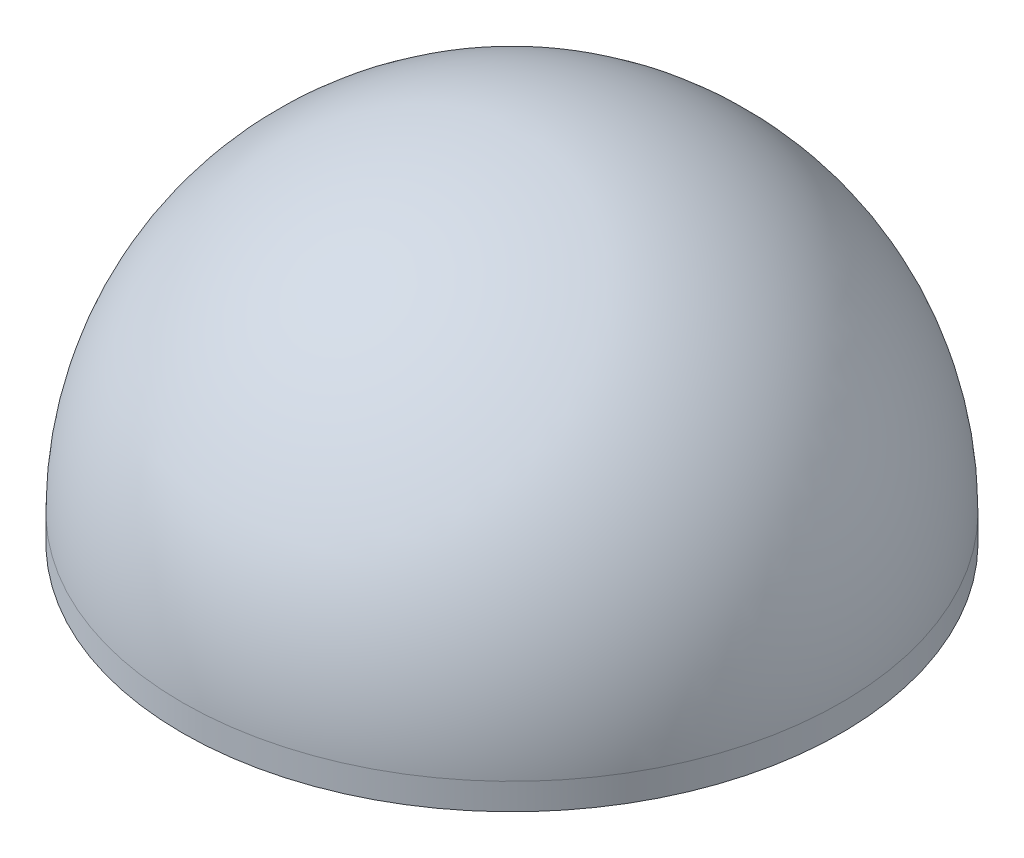
ISO-10303-21;
HEADER;
FILE_DESCRIPTION(('STEP AP214'),'2;1');
FILE_NAME('part.step','',(''),(''),'','','');
FILE_SCHEMA(('AUTOMOTIVE_DESIGN { 1 0 10303 214 1 1 1 1 }'));
ENDSEC;
DATA;
#1=APPLICATION_CONTEXT('core data for automotive mechanical design processes');
#2=APPLICATION_PROTOCOL_DEFINITION('international standard','automotive_design',2000,#1);
#3=PRODUCT_CONTEXT('',#1,'mechanical');
#4=PRODUCT('Part','Part','',(#3));
#5=PRODUCT_RELATED_PRODUCT_CATEGORY('part','',(#4));
#6=PRODUCT_DEFINITION_FORMATION('','',#4);
#7=PRODUCT_DEFINITION_CONTEXT('part definition',#1,'design');
#8=PRODUCT_DEFINITION('design','',#6,#7);
#9=PRODUCT_DEFINITION_SHAPE('','',#8);
#10=(LENGTH_UNIT() NAMED_UNIT(*) SI_UNIT(.MILLI.,.METRE.));
#11=(NAMED_UNIT(*) PLANE_ANGLE_UNIT() SI_UNIT($,.RADIAN.));
#12=(NAMED_UNIT(*) SI_UNIT($,.STERADIAN.) SOLID_ANGLE_UNIT());
#13=UNCERTAINTY_MEASURE_WITH_UNIT(LENGTH_MEASURE(1.E-05),#10,'distance_accuracy_value','');
#14=(GEOMETRIC_REPRESENTATION_CONTEXT(3) GLOBAL_UNCERTAINTY_ASSIGNED_CONTEXT((#13)) GLOBAL_UNIT_ASSIGNED_CONTEXT((#10,
#11,#12)) REPRESENTATION_CONTEXT('',''));
#15=CARTESIAN_POINT('',(0.,0.,0.));
#16=DIRECTION('',(0.,0.,1.));
#17=DIRECTION('',(1.,0.,0.));
#18=AXIS2_PLACEMENT_3D('',#15,#16,#17);
#19=CARTESIAN_POINT('',(0.,2.,0.));
#20=DIRECTION('',(0.,-1.,0.));
#21=DIRECTION('',(0.,0.,-1.));
#22=AXIS2_PLACEMENT_3D('',#19,#20,#21);
#23=CYLINDRICAL_SURFACE('',#22,25.);
#24=CARTESIAN_POINT('',(0.,2.,0.));
#25=DIRECTION('',(0.,1.,0.));
#26=DIRECTION('',(0.,0.,1.));
#27=AXIS2_PLACEMENT_3D('',#24,#25,#26);
#28=CIRCLE('',#27,25.);
#29=CARTESIAN_POINT('',(0.,2.,25.));
#30=VERTEX_POINT('',#29);
#31=EDGE_CURVE('E10',#30,#30,#28,.T.);
#32=ORIENTED_EDGE('',*,*,#31,.F.);
#33=EDGE_LOOP('',(#32));
#34=FACE_BOUND('',#33,.T.);
#35=CARTESIAN_POINT('',(0.,0.,0.));
#36=DIRECTION('',(0.,1.,0.));
#37=DIRECTION('',(0.,0.,1.));
#38=AXIS2_PLACEMENT_3D('',#35,#36,#37);
#39=CIRCLE('',#38,25.);
#40=CARTESIAN_POINT('',(0.,0.,25.));
#41=VERTEX_POINT('',#40);
#42=EDGE_CURVE('E48',#41,#41,#39,.T.);
#43=ORIENTED_EDGE('',*,*,#42,.T.);
#44=EDGE_LOOP('',(#43));
#45=FACE_BOUND('',#44,.T.);
#46=ADVANCED_FACE('F41',(#34,#45),#23,.T.);
#47=CARTESIAN_POINT('',(0.,2.,0.));
#48=DIRECTION('',(0.,0.,1.));
#49=DIRECTION('',(1.,0.,0.));
#50=AXIS2_PLACEMENT_3D('',#47,#48,#49);
#51=SPHERICAL_SURFACE('',#50,25.);
#52=CARTESIAN_POINT('',(0.,2.,0.));
#53=DIRECTION('',(0.,1.,0.));
#54=DIRECTION('',(0.,0.,1.));
#55=AXIS2_PLACEMENT_3D('',#52,#53,#54);
#56=SPHERICAL_SURFACE('',#55,25.);
#57=ORIENTED_EDGE('',*,*,#31,.T.);
#58=EDGE_LOOP('',(#57));
#59=FACE_BOUND('',#58,.T.);
#60=ADVANCED_FACE('F43',(#59),#56,.T.);
#61=CARTESIAN_POINT('',(0.,0.,0.));
#62=DIRECTION('',(0.,1.,0.));
#63=DIRECTION('',(0.,0.,1.));
#64=AXIS2_PLACEMENT_3D('',#61,#62,#63);
#65=PLANE('',#64);
#66=CARTESIAN_POINT('',(0.,0.,0.));
#67=DIRECTION('',(0.,1.,0.));
#68=DIRECTION('',(0.,0.,1.));
#69=AXIS2_PLACEMENT_3D('',#66,#67,#68);
#70=CIRCLE('',#69,23.);
#71=CARTESIAN_POINT('',(0.,0.,23.));
#72=VERTEX_POINT('',#71);
#73=EDGE_CURVE('E56',#72,#72,#70,.T.);
#74=ORIENTED_EDGE('',*,*,#73,.T.);
#75=EDGE_LOOP('',(#74));
#76=FACE_BOUND('',#75,.T.);
#77=ORIENTED_EDGE('',*,*,#42,.F.);
#78=EDGE_LOOP('',(#77));
#79=FACE_BOUND('',#78,.T.);
#80=ADVANCED_FACE('F62',(#76,#79),#65,.F.);
#81=CARTESIAN_POINT('',(0.,2.,0.));
#82=DIRECTION('',(0.,-1.,0.));
#83=DIRECTION('',(0.,0.,-1.));
#84=AXIS2_PLACEMENT_3D('',#81,#82,#83);
#85=CYLINDRICAL_SURFACE('',#84,23.);
#86=CARTESIAN_POINT('',(0.,2.,0.));
#87=DIRECTION('',(0.,-1.,0.));
#88=DIRECTION('',(0.,0.,-1.));
#89=AXIS2_PLACEMENT_3D('',#86,#87,#88);
#90=CIRCLE('',#89,23.);
#91=CARTESIAN_POINT('',(0.,2.,-23.));
#92=VERTEX_POINT('',#91);
#93=EDGE_CURVE('E52',#92,#92,#90,.F.);
#94=ORIENTED_EDGE('',*,*,#93,.T.);
#95=EDGE_LOOP('',(#94));
#96=FACE_BOUND('',#95,.T.);
#97=ORIENTED_EDGE('',*,*,#73,.F.);
#98=EDGE_LOOP('',(#97));
#99=FACE_BOUND('',#98,.T.);
#100=ADVANCED_FACE('F65',(#96,#99),#85,.F.);
#101=CARTESIAN_POINT('',(0.,2.,0.));
#102=DIRECTION('',(0.,0.,1.));
#103=DIRECTION('',(1.,0.,0.));
#104=AXIS2_PLACEMENT_3D('',#101,#102,#103);
#105=SPHERICAL_SURFACE('',#104,23.);
#106=CARTESIAN_POINT('',(0.,2.,0.));
#107=DIRECTION('',(0.,-1.,0.));
#108=DIRECTION('',(0.,0.,-1.));
#109=AXIS2_PLACEMENT_3D('',#106,#107,#108);
#110=SPHERICAL_SURFACE('',#109,23.);
#111=ORIENTED_EDGE('',*,*,#93,.F.);
#112=EDGE_LOOP('',(#111));
#113=FACE_BOUND('',#112,.T.);
#114=ADVANCED_FACE('F67',(#113),#110,.F.);
#115=CLOSED_SHELL('',(#46,#60,#80,#100,#114));
#116=MANIFOLD_SOLID_BREP('B2',#115);
#117=ADVANCED_BREP_SHAPE_REPRESENTATION('',(#18,#116),#14);
#118=SHAPE_DEFINITION_REPRESENTATION(#9,#117);
ENDSEC;
END-ISO-10303-21;
